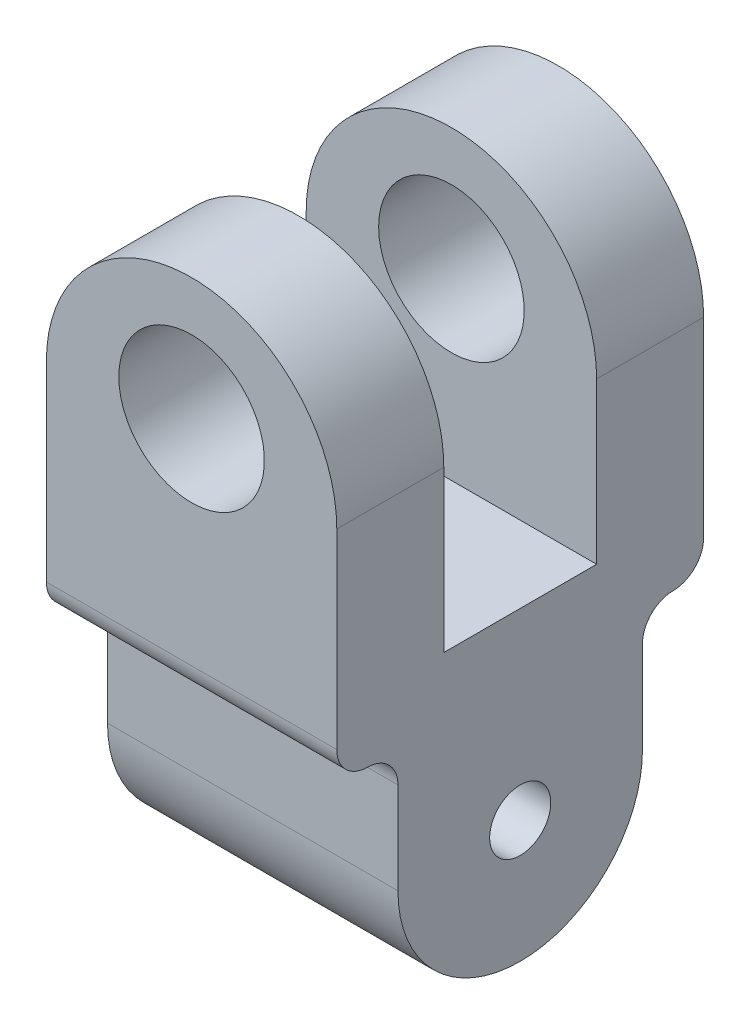
ISO-10303-21;
HEADER;
FILE_DESCRIPTION(('STEP AP214'),'2;1');
FILE_NAME('part.step','',(''),(''),'','','');
FILE_SCHEMA(('AUTOMOTIVE_DESIGN { 1 0 10303 214 1 1 1 1 }'));
ENDSEC;
DATA;
#1=APPLICATION_CONTEXT('core data for automotive mechanical design processes');
#2=APPLICATION_PROTOCOL_DEFINITION('international standard','automotive_design',2000,#1);
#3=PRODUCT_CONTEXT('',#1,'mechanical');
#4=PRODUCT('Part','Part','',(#3));
#5=PRODUCT_RELATED_PRODUCT_CATEGORY('part','',(#4));
#6=PRODUCT_DEFINITION_FORMATION('','',#4);
#7=PRODUCT_DEFINITION_CONTEXT('part definition',#1,'design');
#8=PRODUCT_DEFINITION('design','',#6,#7);
#9=PRODUCT_DEFINITION_SHAPE('','',#8);
#10=(LENGTH_UNIT() NAMED_UNIT(*) SI_UNIT(.MILLI.,.METRE.));
#11=(NAMED_UNIT(*) PLANE_ANGLE_UNIT() SI_UNIT($,.RADIAN.));
#12=(NAMED_UNIT(*) SI_UNIT($,.STERADIAN.) SOLID_ANGLE_UNIT());
#13=UNCERTAINTY_MEASURE_WITH_UNIT(LENGTH_MEASURE(1.E-05),#10,'distance_accuracy_value','');
#14=(GEOMETRIC_REPRESENTATION_CONTEXT(3) GLOBAL_UNCERTAINTY_ASSIGNED_CONTEXT((#13)) GLOBAL_UNIT_ASSIGNED_CONTEXT((#10,
#11,#12)) REPRESENTATION_CONTEXT('',''));
#15=CARTESIAN_POINT('',(0.,0.,0.));
#16=DIRECTION('',(0.,0.,1.));
#17=DIRECTION('',(1.,0.,0.));
#18=AXIS2_PLACEMENT_3D('',#15,#16,#17);
#19=CARTESIAN_POINT('',(-4.75,12.,6.));
#20=DIRECTION('',(0.,0.,-1.));
#21=DIRECTION('',(-1.,0.,0.));
#22=AXIS2_PLACEMENT_3D('',#19,#20,#21);
#23=PLANE('',#22);
#24=CARTESIAN_POINT('',(0.,8.,6.));
#25=DIRECTION('',(0.,0.,-1.));
#26=DIRECTION('',(-1.,0.,0.));
#27=AXIS2_PLACEMENT_3D('',#24,#25,#26);
#28=CIRCLE('',#27,2.38125);
#29=CARTESIAN_POINT('',(-2.38125,8.,6.));
#30=VERTEX_POINT('',#29);
#31=EDGE_CURVE('E184',#30,#30,#28,.T.);
#32=ORIENTED_EDGE('',*,*,#31,.T.);
#33=EDGE_LOOP('',(#32));
#34=FACE_BOUND('',#33,.T.);
#35=DIRECTION('',(0.,-1.,0.));
#36=VECTOR('',#35,1.);
#37=CARTESIAN_POINT('',(-4.75,12.,6.));
#38=LINE('',#37,#36);
#39=CARTESIAN_POINT('',(-4.75,7.25,6.));
#40=VERTEX_POINT('',#39);
#41=CARTESIAN_POINT('',(-4.75,1.,6.));
#42=VERTEX_POINT('',#41);
#43=EDGE_CURVE('E150',#40,#42,#38,.T.);
#44=ORIENTED_EDGE('',*,*,#43,.T.);
#45=DIRECTION('',(1.,0.,0.));
#46=VECTOR('',#45,1.);
#47=CARTESIAN_POINT('',(4.75,1.,6.));
#48=LINE('',#47,#46);
#49=CARTESIAN_POINT('',(4.75,1.,6.));
#50=VERTEX_POINT('',#49);
#51=EDGE_CURVE('E205',#42,#50,#48,.T.);
#52=ORIENTED_EDGE('',*,*,#51,.T.);
#53=DIRECTION('',(0.,-1.,0.));
#54=VECTOR('',#53,1.);
#55=CARTESIAN_POINT('',(4.75,12.,6.));
#56=LINE('',#55,#54);
#57=CARTESIAN_POINT('',(4.75,7.25,6.));
#58=VERTEX_POINT('',#57);
#59=EDGE_CURVE('E153',#58,#50,#56,.T.);
#60=ORIENTED_EDGE('',*,*,#59,.F.);
#61=CARTESIAN_POINT('',(0.,7.25,6.));
#62=DIRECTION('',(0.,0.,-1.));
#63=DIRECTION('',(-1.,0.,0.));
#64=AXIS2_PLACEMENT_3D('',#61,#62,#63);
#65=CIRCLE('',#64,4.75);
#66=EDGE_CURVE('E146',#58,#40,#65,.F.);
#67=ORIENTED_EDGE('',*,*,#66,.T.);
#68=EDGE_LOOP('',(#44,#52,#60,#67));
#69=FACE_BOUND('',#68,.T.);
#70=ADVANCED_FACE('F38',(#34,#69),#23,.F.);
#71=CARTESIAN_POINT('',(-4.75,12.,-6.));
#72=DIRECTION('',(0.,0.,1.));
#73=DIRECTION('',(1.,0.,0.));
#74=AXIS2_PLACEMENT_3D('',#71,#72,#73);
#75=PLANE('',#74);
#76=CARTESIAN_POINT('',(0.,8.,-6.));
#77=DIRECTION('',(0.,0.,-1.));
#78=DIRECTION('',(-1.,0.,0.));
#79=AXIS2_PLACEMENT_3D('',#76,#77,#78);
#80=CIRCLE('',#79,2.38125);
#81=CARTESIAN_POINT('',(-2.38125,8.,-6.));
#82=VERTEX_POINT('',#81);
#83=EDGE_CURVE('E156',#82,#82,#80,.T.);
#84=ORIENTED_EDGE('',*,*,#83,.F.);
#85=EDGE_LOOP('',(#84));
#86=FACE_BOUND('',#85,.T.);
#87=DIRECTION('',(0.,-1.,0.));
#88=VECTOR('',#87,1.);
#89=CARTESIAN_POINT('',(4.75,12.,-6.));
#90=LINE('',#89,#88);
#91=CARTESIAN_POINT('',(4.75,7.25,-6.));
#92=VERTEX_POINT('',#91);
#93=CARTESIAN_POINT('',(4.75,1.,-6.));
#94=VERTEX_POINT('',#93);
#95=EDGE_CURVE('E176',#92,#94,#90,.T.);
#96=ORIENTED_EDGE('',*,*,#95,.T.);
#97=DIRECTION('',(-1.,0.,0.));
#98=VECTOR('',#97,1.);
#99=CARTESIAN_POINT('',(-4.75,1.,-6.));
#100=LINE('',#99,#98);
#101=CARTESIAN_POINT('',(-4.75,1.,-6.));
#102=VERTEX_POINT('',#101);
#103=EDGE_CURVE('E222',#94,#102,#100,.T.);
#104=ORIENTED_EDGE('',*,*,#103,.T.);
#105=DIRECTION('',(0.,-1.,0.));
#106=VECTOR('',#105,1.);
#107=CARTESIAN_POINT('',(-4.75,12.,-6.));
#108=LINE('',#107,#106);
#109=CARTESIAN_POINT('',(-4.75,7.25,-6.));
#110=VERTEX_POINT('',#109);
#111=EDGE_CURVE('E248',#110,#102,#108,.T.);
#112=ORIENTED_EDGE('',*,*,#111,.F.);
#113=CARTESIAN_POINT('',(0.,7.25,-6.));
#114=DIRECTION('',(0.,0.,-1.));
#115=DIRECTION('',(-1.,0.,0.));
#116=AXIS2_PLACEMENT_3D('',#113,#114,#115);
#117=CIRCLE('',#116,4.75);
#118=EDGE_CURVE('E157',#92,#110,#117,.F.);
#119=ORIENTED_EDGE('',*,*,#118,.F.);
#120=EDGE_LOOP('',(#96,#104,#112,#119));
#121=FACE_BOUND('',#120,.T.);
#122=ADVANCED_FACE('F246',(#86,#121),#75,.F.);
#123=CARTESIAN_POINT('',(-6.5,2.,-2.5));
#124=DIRECTION('',(0.,0.,-1.));
#125=DIRECTION('',(-1.,0.,0.));
#126=AXIS2_PLACEMENT_3D('',#123,#124,#125);
#127=PLANE('',#126);
#128=CARTESIAN_POINT('',(0.,8.,-2.5));
#129=DIRECTION('',(0.,0.,-1.));
#130=DIRECTION('',(-1.,0.,0.));
#131=AXIS2_PLACEMENT_3D('',#128,#129,#130);
#132=CIRCLE('',#131,2.38125);
#133=CARTESIAN_POINT('',(-2.38125,8.,-2.5));
#134=VERTEX_POINT('',#133);
#135=EDGE_CURVE('E183',#134,#134,#132,.T.);
#136=ORIENTED_EDGE('',*,*,#135,.T.);
#137=EDGE_LOOP('',(#136));
#138=FACE_BOUND('',#137,.T.);
#139=CARTESIAN_POINT('',(0.,7.25,-2.5));
#140=DIRECTION('',(0.,0.,-1.));
#141=DIRECTION('',(-1.,0.,0.));
#142=AXIS2_PLACEMENT_3D('',#139,#140,#141);
#143=CIRCLE('',#142,4.75);
#144=CARTESIAN_POINT('',(4.75,7.25,-2.5));
#145=VERTEX_POINT('',#144);
#146=CARTESIAN_POINT('',(-4.75,7.25,-2.49999999999999));
#147=VERTEX_POINT('',#146);
#148=EDGE_CURVE('E187',#145,#147,#143,.F.);
#149=ORIENTED_EDGE('',*,*,#148,.T.);
#150=DIRECTION('',(0.,1.,0.));
#151=VECTOR('',#150,1.);
#152=CARTESIAN_POINT('',(-4.75,12.,-2.5));
#153=LINE('',#152,#151);
#154=CARTESIAN_POINT('',(-4.75,2.,-2.5));
#155=VERTEX_POINT('',#154);
#156=EDGE_CURVE('E254',#155,#147,#153,.T.);
#157=ORIENTED_EDGE('',*,*,#156,.F.);
#158=DIRECTION('',(-1.,0.,0.));
#159=VECTOR('',#158,1.);
#160=CARTESIAN_POINT('',(-6.5,2.,-2.5));
#161=LINE('',#160,#159);
#162=CARTESIAN_POINT('',(4.75,2.,-2.5));
#163=VERTEX_POINT('',#162);
#164=EDGE_CURVE('E264',#163,#155,#161,.T.);
#165=ORIENTED_EDGE('',*,*,#164,.F.);
#166=DIRECTION('',(0.,-1.,0.));
#167=VECTOR('',#166,1.);
#168=CARTESIAN_POINT('',(4.75,12.,-2.5));
#169=LINE('',#168,#167);
#170=EDGE_CURVE('E257',#145,#163,#169,.T.);
#171=ORIENTED_EDGE('',*,*,#170,.F.);
#172=EDGE_LOOP('',(#149,#157,#165,#171));
#173=FACE_BOUND('',#172,.T.);
#174=ADVANCED_FACE('F306',(#138,#173),#127,.F.);
#175=CARTESIAN_POINT('',(-6.5,2.,2.5));
#176=DIRECTION('',(0.,0.,1.));
#177=DIRECTION('',(1.,0.,0.));
#178=AXIS2_PLACEMENT_3D('',#175,#176,#177);
#179=PLANE('',#178);
#180=CARTESIAN_POINT('',(0.,8.,2.5));
#181=DIRECTION('',(0.,0.,1.));
#182=DIRECTION('',(1.,0.,0.));
#183=AXIS2_PLACEMENT_3D('',#180,#181,#182);
#184=CIRCLE('',#183,2.38125);
#185=CARTESIAN_POINT('',(2.38125,8.,2.5));
#186=VERTEX_POINT('',#185);
#187=EDGE_CURVE('E180',#186,#186,#184,.T.);
#188=ORIENTED_EDGE('',*,*,#187,.T.);
#189=EDGE_LOOP('',(#188));
#190=FACE_BOUND('',#189,.T.);
#191=DIRECTION('',(0.,-1.,0.));
#192=VECTOR('',#191,1.);
#193=CARTESIAN_POINT('',(-4.75,12.,2.5));
#194=LINE('',#193,#192);
#195=CARTESIAN_POINT('',(-4.75,7.25,2.5));
#196=VERTEX_POINT('',#195);
#197=CARTESIAN_POINT('',(-4.75,2.,2.5));
#198=VERTEX_POINT('',#197);
#199=EDGE_CURVE('E259',#196,#198,#194,.T.);
#200=ORIENTED_EDGE('',*,*,#199,.F.);
#201=CARTESIAN_POINT('',(0.,7.25,2.5));
#202=DIRECTION('',(0.,0.,1.));
#203=DIRECTION('',(1.,0.,0.));
#204=AXIS2_PLACEMENT_3D('',#201,#202,#203);
#205=CIRCLE('',#204,4.75);
#206=CARTESIAN_POINT('',(4.75,7.25,2.5));
#207=VERTEX_POINT('',#206);
#208=EDGE_CURVE('E163',#196,#207,#205,.F.);
#209=ORIENTED_EDGE('',*,*,#208,.T.);
#210=DIRECTION('',(0.,1.,0.));
#211=VECTOR('',#210,1.);
#212=CARTESIAN_POINT('',(4.75,12.,2.5));
#213=LINE('',#212,#211);
#214=CARTESIAN_POINT('',(4.75,2.,2.5));
#215=VERTEX_POINT('',#214);
#216=EDGE_CURVE('E261',#215,#207,#213,.T.);
#217=ORIENTED_EDGE('',*,*,#216,.F.);
#218=DIRECTION('',(1.,0.,0.));
#219=VECTOR('',#218,1.);
#220=CARTESIAN_POINT('',(-6.5,2.,2.5));
#221=LINE('',#220,#219);
#222=EDGE_CURVE('E267',#198,#215,#221,.T.);
#223=ORIENTED_EDGE('',*,*,#222,.F.);
#224=EDGE_LOOP('',(#200,#209,#217,#223));
#225=FACE_BOUND('',#224,.T.);
#226=ADVANCED_FACE('F297',(#190,#225),#179,.F.);
#227=CARTESIAN_POINT('',(-4.75,12.,6.));
#228=DIRECTION('',(1.,0.,0.));
#229=DIRECTION('',(0.,0.,-1.));
#230=AXIS2_PLACEMENT_3D('',#227,#228,#229);
#231=PLANE('',#230);
#232=CARTESIAN_POINT('',(-4.75,-4.,0.));
#233=DIRECTION('',(-1.,0.,0.));
#234=DIRECTION('',(0.,0.,1.));
#235=AXIS2_PLACEMENT_3D('',#232,#233,#234);
#236=CIRCLE('',#235,1.);
#237=CARTESIAN_POINT('',(-4.75,-4.,0.999999999999999));
#238=VERTEX_POINT('',#237);
#239=EDGE_CURVE('E192',#238,#238,#236,.T.);
#240=ORIENTED_EDGE('',*,*,#239,.F.);
#241=EDGE_LOOP('',(#240));
#242=FACE_BOUND('',#241,.T.);
#243=DIRECTION('',(0.,1.,0.));
#244=VECTOR('',#243,1.);
#245=CARTESIAN_POINT('',(-4.75,-8.,4.));
#246=LINE('',#245,#244);
#247=CARTESIAN_POINT('',(-4.75,-4.,4.));
#248=VERTEX_POINT('',#247);
#249=CARTESIAN_POINT('',(-4.75,-1.,4.));
#250=VERTEX_POINT('',#249);
#251=EDGE_CURVE('E191',#248,#250,#246,.T.);
#252=ORIENTED_EDGE('',*,*,#251,.T.);
#253=CARTESIAN_POINT('',(-4.75,-1.,5.));
#254=DIRECTION('',(1.,0.,0.));
#255=DIRECTION('',(0.,0.,-1.));
#256=AXIS2_PLACEMENT_3D('',#253,#254,#255);
#257=CIRCLE('',#256,1.);
#258=CARTESIAN_POINT('',(-4.75,0.,5.));
#259=VERTEX_POINT('',#258);
#260=EDGE_CURVE('E224',#250,#259,#257,.T.);
#261=ORIENTED_EDGE('',*,*,#260,.T.);
#262=CARTESIAN_POINT('',(-4.75,1.,5.));
#263=DIRECTION('',(1.,0.,0.));
#264=DIRECTION('',(0.,0.,-1.));
#265=AXIS2_PLACEMENT_3D('',#262,#263,#264);
#266=CIRCLE('',#265,1.);
#267=EDGE_CURVE('E171',#259,#42,#266,.F.);
#268=ORIENTED_EDGE('',*,*,#267,.T.);
#269=ORIENTED_EDGE('',*,*,#43,.F.);
#270=DIRECTION('',(0.,0.,-1.));
#271=VECTOR('',#270,1.);
#272=CARTESIAN_POINT('',(-4.75,7.25,7.));
#273=LINE('',#272,#271);
#274=EDGE_CURVE('E160',#40,#196,#273,.T.);
#275=ORIENTED_EDGE('',*,*,#274,.T.);
#276=ORIENTED_EDGE('',*,*,#199,.T.);
#277=DIRECTION('',(0.,0.,-1.));
#278=VECTOR('',#277,1.);
#279=CARTESIAN_POINT('',(-4.75,2.,6.));
#280=LINE('',#279,#278);
#281=EDGE_CURVE('E249',#198,#155,#280,.T.);
#282=ORIENTED_EDGE('',*,*,#281,.T.);
#283=ORIENTED_EDGE('',*,*,#156,.T.);
#284=EDGE_CURVE('E166',#147,#110,#273,.T.);
#285=ORIENTED_EDGE('',*,*,#284,.T.);
#286=ORIENTED_EDGE('',*,*,#111,.T.);
#287=CARTESIAN_POINT('',(-4.75,1.,-5.));
#288=DIRECTION('',(1.,0.,0.));
#289=DIRECTION('',(0.,0.,-1.));
#290=AXIS2_PLACEMENT_3D('',#287,#288,#289);
#291=CIRCLE('',#290,1.);
#292=CARTESIAN_POINT('',(-4.75,0.,-5.));
#293=VERTEX_POINT('',#292);
#294=EDGE_CURVE('E58',#102,#293,#291,.F.);
#295=ORIENTED_EDGE('',*,*,#294,.T.);
#296=CARTESIAN_POINT('',(-4.75,-1.,-5.));
#297=DIRECTION('',(1.,0.,0.));
#298=DIRECTION('',(0.,0.,-1.));
#299=AXIS2_PLACEMENT_3D('',#296,#297,#298);
#300=CIRCLE('',#299,1.);
#301=CARTESIAN_POINT('',(-4.75,-1.,-4.));
#302=VERTEX_POINT('',#301);
#303=EDGE_CURVE('E11',#293,#302,#300,.T.);
#304=ORIENTED_EDGE('',*,*,#303,.T.);
#305=DIRECTION('',(0.,1.,0.));
#306=VECTOR('',#305,1.);
#307=CARTESIAN_POINT('',(-4.75,-8.,-4.));
#308=LINE('',#307,#306);
#309=CARTESIAN_POINT('',(-4.75,-4.,-4.));
#310=VERTEX_POINT('',#309);
#311=EDGE_CURVE('E282',#310,#302,#308,.T.);
#312=ORIENTED_EDGE('',*,*,#311,.F.);
#313=CARTESIAN_POINT('',(-4.75,-4.,0.));
#314=DIRECTION('',(1.,0.,0.));
#315=DIRECTION('',(0.,0.,-1.));
#316=AXIS2_PLACEMENT_3D('',#313,#314,#315);
#317=CIRCLE('',#316,4.);
#318=CARTESIAN_POINT('',(-4.75,-8.,0.));
#319=VERTEX_POINT('',#318);
#320=EDGE_CURVE('E165',#310,#319,#317,.F.);
#321=ORIENTED_EDGE('',*,*,#320,.T.);
#322=CARTESIAN_POINT('',(-4.75,-4.,0.));
#323=DIRECTION('',(1.,0.,0.));
#324=DIRECTION('',(0.,0.,-1.));
#325=AXIS2_PLACEMENT_3D('',#322,#323,#324);
#326=CIRCLE('',#325,4.);
#327=EDGE_CURVE('E194',#319,#248,#326,.F.);
#328=ORIENTED_EDGE('',*,*,#327,.T.);
#329=EDGE_LOOP('',(#252,#261,#268,#269,#275,#276,#282,#283,#285,#286,#295,#304,#312,#321,#328));
#330=FACE_BOUND('',#329,.T.);
#331=ADVANCED_FACE('F169',(#242,#330),#231,.F.);
#332=CARTESIAN_POINT('',(4.75,12.,6.));
#333=DIRECTION('',(-1.,0.,0.));
#334=DIRECTION('',(0.,0.,1.));
#335=AXIS2_PLACEMENT_3D('',#332,#333,#334);
#336=PLANE('',#335);
#337=CARTESIAN_POINT('',(4.75,-4.,0.));
#338=DIRECTION('',(-1.,0.,0.));
#339=DIRECTION('',(0.,0.,1.));
#340=AXIS2_PLACEMENT_3D('',#337,#338,#339);
#341=CIRCLE('',#340,1.);
#342=CARTESIAN_POINT('',(4.75,-4.,0.999999999999996));
#343=VERTEX_POINT('',#342);
#344=EDGE_CURVE('E188',#343,#343,#341,.T.);
#345=ORIENTED_EDGE('',*,*,#344,.T.);
#346=EDGE_LOOP('',(#345));
#347=FACE_BOUND('',#346,.T.);
#348=ORIENTED_EDGE('',*,*,#59,.T.);
#349=CARTESIAN_POINT('',(4.75,1.,5.));
#350=DIRECTION('',(-1.,0.,0.));
#351=DIRECTION('',(0.,0.,1.));
#352=AXIS2_PLACEMENT_3D('',#349,#350,#351);
#353=CIRCLE('',#352,1.);
#354=CARTESIAN_POINT('',(4.75,0.,5.));
#355=VERTEX_POINT('',#354);
#356=EDGE_CURVE('E213',#50,#355,#353,.F.);
#357=ORIENTED_EDGE('',*,*,#356,.T.);
#358=CARTESIAN_POINT('',(4.75,-1.,5.));
#359=DIRECTION('',(-1.,0.,0.));
#360=DIRECTION('',(0.,0.,1.));
#361=AXIS2_PLACEMENT_3D('',#358,#359,#360);
#362=CIRCLE('',#361,1.);
#363=CARTESIAN_POINT('',(4.75,-1.,4.));
#364=VERTEX_POINT('',#363);
#365=EDGE_CURVE('E226',#355,#364,#362,.T.);
#366=ORIENTED_EDGE('',*,*,#365,.T.);
#367=DIRECTION('',(0.,1.,0.));
#368=VECTOR('',#367,1.);
#369=CARTESIAN_POINT('',(4.75,-8.,4.));
#370=LINE('',#369,#368);
#371=CARTESIAN_POINT('',(4.75,-4.,4.));
#372=VERTEX_POINT('',#371);
#373=EDGE_CURVE('E286',#372,#364,#370,.T.);
#374=ORIENTED_EDGE('',*,*,#373,.F.);
#375=CARTESIAN_POINT('',(4.75,-4.,0.));
#376=DIRECTION('',(-1.,0.,0.));
#377=DIRECTION('',(0.,0.,1.));
#378=AXIS2_PLACEMENT_3D('',#375,#376,#377);
#379=CIRCLE('',#378,4.);
#380=CARTESIAN_POINT('',(4.75,-8.,0.));
#381=VERTEX_POINT('',#380);
#382=EDGE_CURVE('E201',#372,#381,#379,.F.);
#383=ORIENTED_EDGE('',*,*,#382,.T.);
#384=CARTESIAN_POINT('',(4.75,-4.,0.));
#385=DIRECTION('',(-1.,0.,0.));
#386=DIRECTION('',(0.,0.,1.));
#387=AXIS2_PLACEMENT_3D('',#384,#385,#386);
#388=CIRCLE('',#387,4.);
#389=CARTESIAN_POINT('',(4.75,-4.,-4.));
#390=VERTEX_POINT('',#389);
#391=EDGE_CURVE('E199',#381,#390,#388,.F.);
#392=ORIENTED_EDGE('',*,*,#391,.T.);
#393=DIRECTION('',(0.,1.,0.));
#394=VECTOR('',#393,1.);
#395=CARTESIAN_POINT('',(4.75,-8.,-4.));
#396=LINE('',#395,#394);
#397=CARTESIAN_POINT('',(4.75,-1.,-4.));
#398=VERTEX_POINT('',#397);
#399=EDGE_CURVE('E284',#390,#398,#396,.T.);
#400=ORIENTED_EDGE('',*,*,#399,.T.);
#401=CARTESIAN_POINT('',(4.75,-1.,-5.));
#402=DIRECTION('',(-1.,0.,0.));
#403=DIRECTION('',(0.,0.,1.));
#404=AXIS2_PLACEMENT_3D('',#401,#402,#403);
#405=CIRCLE('',#404,1.);
#406=CARTESIAN_POINT('',(4.75,0.,-5.));
#407=VERTEX_POINT('',#406);
#408=EDGE_CURVE('E47',#398,#407,#405,.T.);
#409=ORIENTED_EDGE('',*,*,#408,.T.);
#410=CARTESIAN_POINT('',(4.75,1.,-5.));
#411=DIRECTION('',(-1.,0.,0.));
#412=DIRECTION('',(0.,0.,1.));
#413=AXIS2_PLACEMENT_3D('',#410,#411,#412);
#414=CIRCLE('',#413,1.);
#415=EDGE_CURVE('E211',#407,#94,#414,.F.);
#416=ORIENTED_EDGE('',*,*,#415,.T.);
#417=ORIENTED_EDGE('',*,*,#95,.F.);
#418=DIRECTION('',(0.,0.,-1.));
#419=VECTOR('',#418,1.);
#420=CARTESIAN_POINT('',(4.75,7.25,7.));
#421=LINE('',#420,#419);
#422=EDGE_CURVE('E279',#145,#92,#421,.T.);
#423=ORIENTED_EDGE('',*,*,#422,.F.);
#424=ORIENTED_EDGE('',*,*,#170,.T.);
#425=DIRECTION('',(0.,0.,1.));
#426=VECTOR('',#425,1.);
#427=CARTESIAN_POINT('',(4.75,2.,6.));
#428=LINE('',#427,#426);
#429=EDGE_CURVE('E172',#163,#215,#428,.T.);
#430=ORIENTED_EDGE('',*,*,#429,.T.);
#431=ORIENTED_EDGE('',*,*,#216,.T.);
#432=EDGE_CURVE('E277',#58,#207,#421,.T.);
#433=ORIENTED_EDGE('',*,*,#432,.F.);
#434=EDGE_LOOP('',(#348,#357,#366,#374,#383,#392,#400,#409,#416,#417,#423,#424,#430,#431,#433));
#435=FACE_BOUND('',#434,.T.);
#436=ADVANCED_FACE('F241',(#347,#435),#336,.F.);
#437=CARTESIAN_POINT('',(0.,2.,0.));
#438=DIRECTION('',(0.,-1.,0.));
#439=DIRECTION('',(0.,0.,-1.));
#440=AXIS2_PLACEMENT_3D('',#437,#438,#439);
#441=PLANE('',#440);
#442=ORIENTED_EDGE('',*,*,#222,.T.);
#443=ORIENTED_EDGE('',*,*,#429,.F.);
#444=ORIENTED_EDGE('',*,*,#164,.T.);
#445=ORIENTED_EDGE('',*,*,#281,.F.);
#446=EDGE_LOOP('',(#442,#443,#444,#445));
#447=FACE_BOUND('',#446,.T.);
#448=ADVANCED_FACE('F303',(#447),#441,.F.);
#449=CARTESIAN_POINT('',(0.,8.,6.));
#450=DIRECTION('',(0.,0.,-1.));
#451=DIRECTION('',(-1.,0.,0.));
#452=AXIS2_PLACEMENT_3D('',#449,#450,#451);
#453=CYLINDRICAL_SURFACE('',#452,2.38125);
#454=ORIENTED_EDGE('',*,*,#31,.F.);
#455=EDGE_LOOP('',(#454));
#456=FACE_BOUND('',#455,.T.);
#457=ORIENTED_EDGE('',*,*,#187,.F.);
#458=EDGE_LOOP('',(#457));
#459=FACE_BOUND('',#458,.T.);
#460=ADVANCED_FACE('F324',(#456,#459),#453,.F.);
#461=ORIENTED_EDGE('',*,*,#83,.T.);
#462=EDGE_LOOP('',(#461));
#463=FACE_BOUND('',#462,.T.);
#464=ORIENTED_EDGE('',*,*,#135,.F.);
#465=EDGE_LOOP('',(#464));
#466=FACE_BOUND('',#465,.T.);
#467=ADVANCED_FACE('F326',(#463,#466),#453,.F.);
#468=CARTESIAN_POINT('',(0.,7.25,7.));
#469=DIRECTION('',(0.,0.,-1.));
#470=DIRECTION('',(-1.,0.,0.));
#471=AXIS2_PLACEMENT_3D('',#468,#469,#470);
#472=CYLINDRICAL_SURFACE('',#471,4.75);
#473=ORIENTED_EDGE('',*,*,#432,.T.);
#474=ORIENTED_EDGE('',*,*,#208,.F.);
#475=ORIENTED_EDGE('',*,*,#274,.F.);
#476=ORIENTED_EDGE('',*,*,#66,.F.);
#477=EDGE_LOOP('',(#473,#474,#475,#476));
#478=FACE_BOUND('',#477,.T.);
#479=ADVANCED_FACE('F161',(#478),#472,.T.);
#480=ORIENTED_EDGE('',*,*,#118,.T.);
#481=ORIENTED_EDGE('',*,*,#284,.F.);
#482=ORIENTED_EDGE('',*,*,#148,.F.);
#483=ORIENTED_EDGE('',*,*,#422,.T.);
#484=EDGE_LOOP('',(#480,#481,#482,#483));
#485=FACE_BOUND('',#484,.T.);
#486=ADVANCED_FACE('F332',(#485),#472,.T.);
#487=CARTESIAN_POINT('',(-4.75,-8.,-4.));
#488=DIRECTION('',(0.,0.,1.));
#489=DIRECTION('',(1.,0.,0.));
#490=AXIS2_PLACEMENT_3D('',#487,#488,#489);
#491=PLANE('',#490);
#492=ORIENTED_EDGE('',*,*,#311,.T.);
#493=DIRECTION('',(1.,0.,0.));
#494=VECTOR('',#493,1.);
#495=CARTESIAN_POINT('',(-4.75,-1.,-4.));
#496=LINE('',#495,#494);
#497=EDGE_CURVE('E219',#302,#398,#496,.T.);
#498=ORIENTED_EDGE('',*,*,#497,.T.);
#499=ORIENTED_EDGE('',*,*,#399,.F.);
#500=DIRECTION('',(1.,0.,0.));
#501=VECTOR('',#500,1.);
#502=CARTESIAN_POINT('',(-4.75,-4.,-4.));
#503=LINE('',#502,#501);
#504=EDGE_CURVE('E203',#390,#310,#503,.F.);
#505=ORIENTED_EDGE('',*,*,#504,.T.);
#506=EDGE_LOOP('',(#492,#498,#499,#505));
#507=FACE_BOUND('',#506,.T.);
#508=ADVANCED_FACE('F333',(#507),#491,.F.);
#509=CARTESIAN_POINT('',(-4.75,-8.,4.));
#510=DIRECTION('',(0.,0.,-1.));
#511=DIRECTION('',(-1.,0.,0.));
#512=AXIS2_PLACEMENT_3D('',#509,#510,#511);
#513=PLANE('',#512);
#514=ORIENTED_EDGE('',*,*,#373,.T.);
#515=DIRECTION('',(-1.,0.,0.));
#516=VECTOR('',#515,1.);
#517=CARTESIAN_POINT('',(-4.75,-1.,4.));
#518=LINE('',#517,#516);
#519=EDGE_CURVE('E217',#364,#250,#518,.T.);
#520=ORIENTED_EDGE('',*,*,#519,.T.);
#521=ORIENTED_EDGE('',*,*,#251,.F.);
#522=DIRECTION('',(-1.,0.,0.));
#523=VECTOR('',#522,1.);
#524=CARTESIAN_POINT('',(-4.75,-4.,4.));
#525=LINE('',#524,#523);
#526=EDGE_CURVE('E196',#248,#372,#525,.F.);
#527=ORIENTED_EDGE('',*,*,#526,.T.);
#528=EDGE_LOOP('',(#514,#520,#521,#527));
#529=FACE_BOUND('',#528,.T.);
#530=ADVANCED_FACE('F336',(#529),#513,.F.);
#531=CARTESIAN_POINT('',(5.25,-4.,0.));
#532=DIRECTION('',(-1.,0.,0.));
#533=DIRECTION('',(0.,0.,1.));
#534=AXIS2_PLACEMENT_3D('',#531,#532,#533);
#535=CYLINDRICAL_SURFACE('',#534,1.);
#536=ORIENTED_EDGE('',*,*,#239,.T.);
#537=EDGE_LOOP('',(#536));
#538=FACE_BOUND('',#537,.T.);
#539=ORIENTED_EDGE('',*,*,#344,.F.);
#540=EDGE_LOOP('',(#539));
#541=FACE_BOUND('',#540,.T.);
#542=ADVANCED_FACE('F293',(#538,#541),#535,.F.);
#543=CARTESIAN_POINT('',(0.,-4.,0.));
#544=DIRECTION('',(1.,0.,0.));
#545=DIRECTION('',(0.,0.,-1.));
#546=AXIS2_PLACEMENT_3D('',#543,#544,#545);
#547=CYLINDRICAL_SURFACE('',#546,4.);
#548=ORIENTED_EDGE('',*,*,#504,.F.);
#549=ORIENTED_EDGE('',*,*,#391,.F.);
#550=DIRECTION('',(1.,0.,0.));
#551=VECTOR('',#550,1.);
#552=CARTESIAN_POINT('',(0.,-8.,0.));
#553=LINE('',#552,#551);
#554=EDGE_CURVE('E206',#319,#381,#553,.T.);
#555=ORIENTED_EDGE('',*,*,#554,.F.);
#556=ORIENTED_EDGE('',*,*,#320,.F.);
#557=EDGE_LOOP('',(#548,#549,#555,#556));
#558=FACE_BOUND('',#557,.T.);
#559=ADVANCED_FACE('F342',(#558),#547,.T.);
#560=CARTESIAN_POINT('',(0.,-4.,0.));
#561=DIRECTION('',(-1.,0.,0.));
#562=DIRECTION('',(0.,0.,1.));
#563=AXIS2_PLACEMENT_3D('',#560,#561,#562);
#564=CYLINDRICAL_SURFACE('',#563,4.);
#565=ORIENTED_EDGE('',*,*,#382,.F.);
#566=ORIENTED_EDGE('',*,*,#526,.F.);
#567=ORIENTED_EDGE('',*,*,#327,.F.);
#568=ORIENTED_EDGE('',*,*,#554,.T.);
#569=EDGE_LOOP('',(#565,#566,#567,#568));
#570=FACE_BOUND('',#569,.T.);
#571=ADVANCED_FACE('F346',(#570),#564,.T.);
#572=CARTESIAN_POINT('',(-4.75,-1.,5.));
#573=DIRECTION('',(-1.,0.,0.));
#574=DIRECTION('',(0.,0.,1.));
#575=AXIS2_PLACEMENT_3D('',#572,#573,#574);
#576=CYLINDRICAL_SURFACE('',#575,1.);
#577=DIRECTION('',(-1.,0.,0.));
#578=VECTOR('',#577,1.);
#579=CARTESIAN_POINT('',(0.,0.,5.));
#580=LINE('',#579,#578);
#581=EDGE_CURVE('E209',#259,#355,#580,.F.);
#582=ORIENTED_EDGE('',*,*,#581,.F.);
#583=ORIENTED_EDGE('',*,*,#260,.F.);
#584=ORIENTED_EDGE('',*,*,#519,.F.);
#585=ORIENTED_EDGE('',*,*,#365,.F.);
#586=EDGE_LOOP('',(#582,#583,#584,#585));
#587=FACE_BOUND('',#586,.T.);
#588=ADVANCED_FACE('F352',(#587),#576,.F.);
#589=CARTESIAN_POINT('',(-4.75,1.,5.));
#590=DIRECTION('',(-1.,0.,0.));
#591=DIRECTION('',(0.,0.,1.));
#592=AXIS2_PLACEMENT_3D('',#589,#590,#591);
#593=CYLINDRICAL_SURFACE('',#592,1.);
#594=ORIENTED_EDGE('',*,*,#267,.F.);
#595=ORIENTED_EDGE('',*,*,#581,.T.);
#596=ORIENTED_EDGE('',*,*,#356,.F.);
#597=ORIENTED_EDGE('',*,*,#51,.F.);
#598=EDGE_LOOP('',(#594,#595,#596,#597));
#599=FACE_BOUND('',#598,.T.);
#600=ADVANCED_FACE('F356',(#599),#593,.T.);
#601=CARTESIAN_POINT('',(-4.75,1.,-5.));
#602=DIRECTION('',(1.,0.,0.));
#603=DIRECTION('',(0.,0.,-1.));
#604=AXIS2_PLACEMENT_3D('',#601,#602,#603);
#605=CYLINDRICAL_SURFACE('',#604,1.);
#606=DIRECTION('',(-1.,0.,0.));
#607=VECTOR('',#606,1.);
#608=CARTESIAN_POINT('',(4.75,0.,-5.));
#609=LINE('',#608,#607);
#610=EDGE_CURVE('E42',#293,#407,#609,.F.);
#611=ORIENTED_EDGE('',*,*,#610,.F.);
#612=ORIENTED_EDGE('',*,*,#294,.F.);
#613=ORIENTED_EDGE('',*,*,#103,.F.);
#614=ORIENTED_EDGE('',*,*,#415,.F.);
#615=EDGE_LOOP('',(#611,#612,#613,#614));
#616=FACE_BOUND('',#615,.T.);
#617=ADVANCED_FACE('F40',(#616),#605,.T.);
#618=CARTESIAN_POINT('',(-4.75,-1.,-5.));
#619=DIRECTION('',(1.,0.,0.));
#620=DIRECTION('',(0.,0.,-1.));
#621=AXIS2_PLACEMENT_3D('',#618,#619,#620);
#622=CYLINDRICAL_SURFACE('',#621,1.);
#623=ORIENTED_EDGE('',*,*,#303,.F.);
#624=ORIENTED_EDGE('',*,*,#610,.T.);
#625=ORIENTED_EDGE('',*,*,#408,.F.);
#626=ORIENTED_EDGE('',*,*,#497,.F.);
#627=EDGE_LOOP('',(#623,#624,#625,#626));
#628=FACE_BOUND('',#627,.T.);
#629=ADVANCED_FACE('F233',(#628),#622,.F.);
#630=CLOSED_SHELL('',(#70,#122,#174,#226,#331,#436,#448,#460,#467,#479,#486,#508,#530,#542,#559,
#571,#588,#600,#617,#629));
#631=MANIFOLD_SOLID_BREP('B2',#630);
#632=ADVANCED_BREP_SHAPE_REPRESENTATION('',(#18,#631),#14);
#633=SHAPE_DEFINITION_REPRESENTATION(#9,#632);
ENDSEC;
END-ISO-10303-21;
